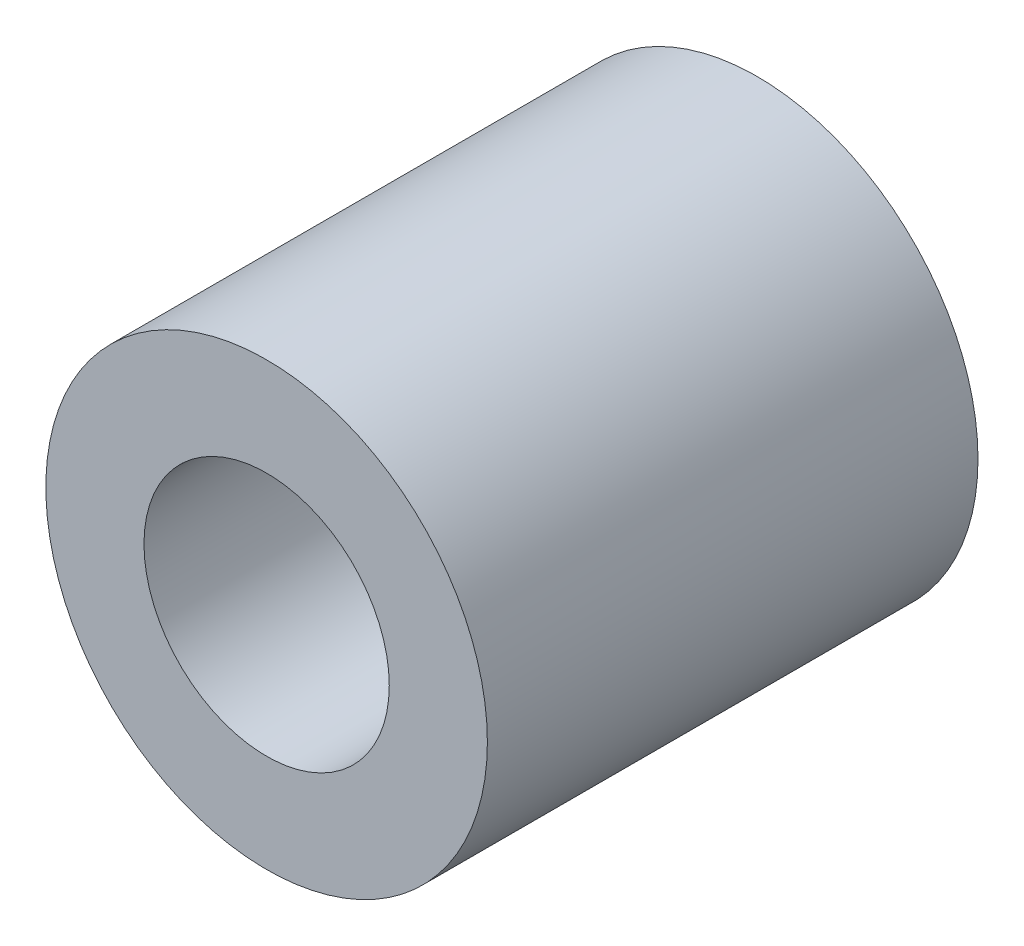
ISO-10303-21;
HEADER;
FILE_DESCRIPTION(('STEP AP214'),'2;1');
FILE_NAME('part.step','',(''),(''),'','','');
FILE_SCHEMA(('AUTOMOTIVE_DESIGN { 1 0 10303 214 1 1 1 1 }'));
ENDSEC;
DATA;
#1=APPLICATION_CONTEXT('core data for automotive mechanical design processes');
#2=APPLICATION_PROTOCOL_DEFINITION('international standard','automotive_design',2000,#1);
#3=PRODUCT_CONTEXT('',#1,'mechanical');
#4=PRODUCT('Part','Part','',(#3));
#5=PRODUCT_RELATED_PRODUCT_CATEGORY('part','',(#4));
#6=PRODUCT_DEFINITION_FORMATION('','',#4);
#7=PRODUCT_DEFINITION_CONTEXT('part definition',#1,'design');
#8=PRODUCT_DEFINITION('design','',#6,#7);
#9=PRODUCT_DEFINITION_SHAPE('','',#8);
#10=(LENGTH_UNIT() NAMED_UNIT(*) SI_UNIT(.MILLI.,.METRE.));
#11=(NAMED_UNIT(*) PLANE_ANGLE_UNIT() SI_UNIT($,.RADIAN.));
#12=(NAMED_UNIT(*) SI_UNIT($,.STERADIAN.) SOLID_ANGLE_UNIT());
#13=UNCERTAINTY_MEASURE_WITH_UNIT(LENGTH_MEASURE(1.E-05),#10,'distance_accuracy_value','');
#14=(GEOMETRIC_REPRESENTATION_CONTEXT(3) GLOBAL_UNCERTAINTY_ASSIGNED_CONTEXT((#13)) GLOBAL_UNIT_ASSIGNED_CONTEXT((#10,
#11,#12)) REPRESENTATION_CONTEXT('',''));
#15=CARTESIAN_POINT('',(0.,0.,0.));
#16=DIRECTION('',(0.,0.,1.));
#17=DIRECTION('',(1.,0.,0.));
#18=AXIS2_PLACEMENT_3D('',#15,#16,#17);
#19=CARTESIAN_POINT('',(0.,0.,10.));
#20=DIRECTION('',(0.,0.,1.));
#21=DIRECTION('',(1.,0.,0.));
#22=AXIS2_PLACEMENT_3D('',#19,#20,#21);
#23=PLANE('',#22);
#24=CARTESIAN_POINT('',(0.,0.,10.));
#25=DIRECTION('',(0.,0.,1.));
#26=DIRECTION('',(1.,0.,0.));
#27=AXIS2_PLACEMENT_3D('',#24,#25,#26);
#28=CIRCLE('',#27,4.5);
#29=CARTESIAN_POINT('',(4.5,0.,10.));
#30=VERTEX_POINT('',#29);
#31=EDGE_CURVE('E10',#30,#30,#28,.T.);
#32=ORIENTED_EDGE('',*,*,#31,.T.);
#33=EDGE_LOOP('',(#32));
#34=FACE_BOUND('',#33,.T.);
#35=CARTESIAN_POINT('',(0.,0.,10.));
#36=DIRECTION('',(0.,0.,1.));
#37=DIRECTION('',(1.,0.,0.));
#38=AXIS2_PLACEMENT_3D('',#35,#36,#37);
#39=CIRCLE('',#38,2.5);
#40=CARTESIAN_POINT('',(2.5,0.,10.));
#41=VERTEX_POINT('',#40);
#42=EDGE_CURVE('E48',#41,#41,#39,.T.);
#43=ORIENTED_EDGE('',*,*,#42,.F.);
#44=EDGE_LOOP('',(#43));
#45=FACE_BOUND('',#44,.T.);
#46=ADVANCED_FACE('F37',(#34,#45),#23,.T.);
#47=CARTESIAN_POINT('',(0.,0.,0.));
#48=DIRECTION('',(0.,0.,1.));
#49=DIRECTION('',(1.,0.,0.));
#50=AXIS2_PLACEMENT_3D('',#47,#48,#49);
#51=PLANE('',#50);
#52=CARTESIAN_POINT('',(0.,0.,0.));
#53=DIRECTION('',(0.,0.,1.));
#54=DIRECTION('',(1.,0.,0.));
#55=AXIS2_PLACEMENT_3D('',#52,#53,#54);
#56=CIRCLE('',#55,4.5);
#57=CARTESIAN_POINT('',(4.5,0.,0.));
#58=VERTEX_POINT('',#57);
#59=EDGE_CURVE('E41',#58,#58,#56,.T.);
#60=ORIENTED_EDGE('',*,*,#59,.F.);
#61=EDGE_LOOP('',(#60));
#62=FACE_BOUND('',#61,.T.);
#63=CARTESIAN_POINT('',(0.,0.,0.));
#64=DIRECTION('',(0.,0.,1.));
#65=DIRECTION('',(1.,0.,0.));
#66=AXIS2_PLACEMENT_3D('',#63,#64,#65);
#67=CIRCLE('',#66,2.5);
#68=CARTESIAN_POINT('',(2.5,0.,0.));
#69=VERTEX_POINT('',#68);
#70=EDGE_CURVE('E50',#69,#69,#67,.T.);
#71=ORIENTED_EDGE('',*,*,#70,.T.);
#72=EDGE_LOOP('',(#71));
#73=FACE_BOUND('',#72,.T.);
#74=ADVANCED_FACE('F60',(#62,#73),#51,.F.);
#75=CARTESIAN_POINT('',(0.,0.,10.));
#76=DIRECTION('',(0.,0.,-1.));
#77=DIRECTION('',(-1.,0.,0.));
#78=AXIS2_PLACEMENT_3D('',#75,#76,#77);
#79=CYLINDRICAL_SURFACE('',#78,4.5);
#80=ORIENTED_EDGE('',*,*,#31,.F.);
#81=EDGE_LOOP('',(#80));
#82=FACE_BOUND('',#81,.T.);
#83=ORIENTED_EDGE('',*,*,#59,.T.);
#84=EDGE_LOOP('',(#83));
#85=FACE_BOUND('',#84,.T.);
#86=ADVANCED_FACE('F39',(#82,#85),#79,.T.);
#87=CARTESIAN_POINT('',(0.,0.,10.));
#88=DIRECTION('',(0.,0.,-1.));
#89=DIRECTION('',(-1.,0.,0.));
#90=AXIS2_PLACEMENT_3D('',#87,#88,#89);
#91=CYLINDRICAL_SURFACE('',#90,2.5);
#92=ORIENTED_EDGE('',*,*,#42,.T.);
#93=EDGE_LOOP('',(#92));
#94=FACE_BOUND('',#93,.T.);
#95=ORIENTED_EDGE('',*,*,#70,.F.);
#96=EDGE_LOOP('',(#95));
#97=FACE_BOUND('',#96,.T.);
#98=ADVANCED_FACE('F56',(#94,#97),#91,.F.);
#99=CLOSED_SHELL('',(#46,#74,#86,#98));
#100=MANIFOLD_SOLID_BREP('B2',#99);
#101=ADVANCED_BREP_SHAPE_REPRESENTATION('',(#18,#100),#14);
#102=SHAPE_DEFINITION_REPRESENTATION(#9,#101);
ENDSEC;
END-ISO-10303-21;
